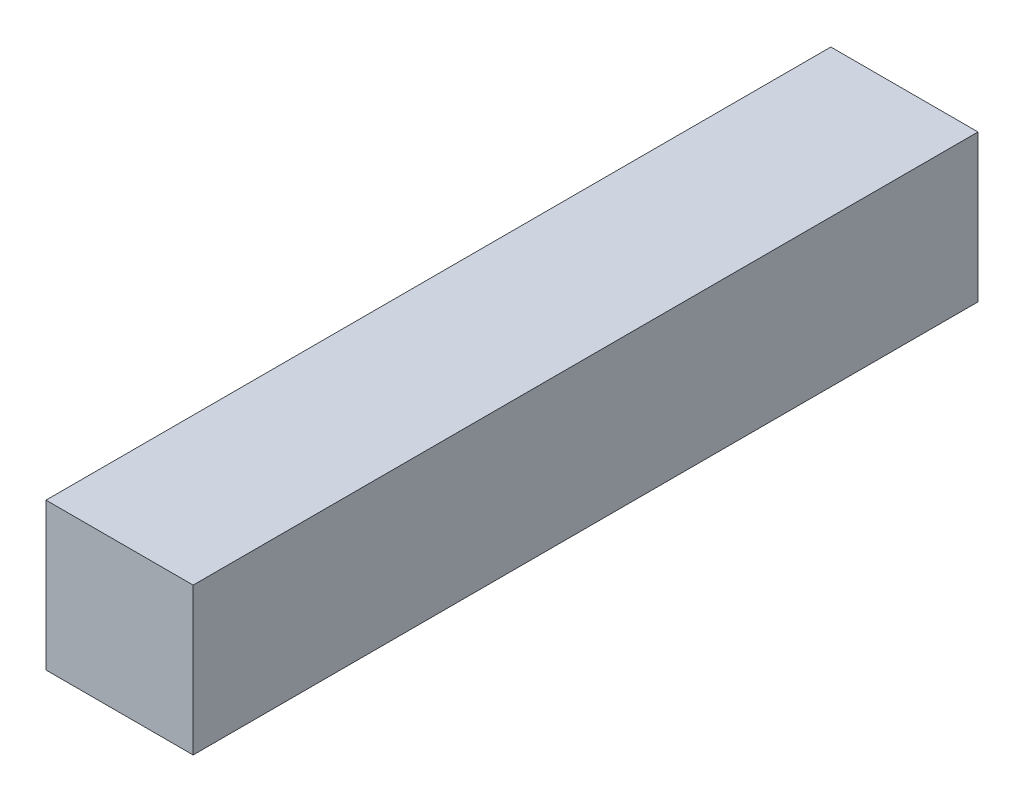
ISO-10303-21;
HEADER;
FILE_DESCRIPTION(('STEP AP214'),'2;1');
FILE_NAME('part.step','',(''),(''),'','','');
FILE_SCHEMA(('AUTOMOTIVE_DESIGN { 1 0 10303 214 1 1 1 1 }'));
ENDSEC;
DATA;
#1=APPLICATION_CONTEXT('core data for automotive mechanical design processes');
#2=APPLICATION_PROTOCOL_DEFINITION('international standard','automotive_design',2000,#1);
#3=PRODUCT_CONTEXT('',#1,'mechanical');
#4=PRODUCT('Part','Part','',(#3));
#5=PRODUCT_RELATED_PRODUCT_CATEGORY('part','',(#4));
#6=PRODUCT_DEFINITION_FORMATION('','',#4);
#7=PRODUCT_DEFINITION_CONTEXT('part definition',#1,'design');
#8=PRODUCT_DEFINITION('design','',#6,#7);
#9=PRODUCT_DEFINITION_SHAPE('','',#8);
#10=(LENGTH_UNIT() NAMED_UNIT(*) SI_UNIT(.MILLI.,.METRE.));
#11=(NAMED_UNIT(*) PLANE_ANGLE_UNIT() SI_UNIT($,.RADIAN.));
#12=(NAMED_UNIT(*) SI_UNIT($,.STERADIAN.) SOLID_ANGLE_UNIT());
#13=UNCERTAINTY_MEASURE_WITH_UNIT(LENGTH_MEASURE(1.E-05),#10,'distance_accuracy_value','');
#14=(GEOMETRIC_REPRESENTATION_CONTEXT(3) GLOBAL_UNCERTAINTY_ASSIGNED_CONTEXT((#13)) GLOBAL_UNIT_ASSIGNED_CONTEXT((#10,
#11,#12)) REPRESENTATION_CONTEXT('',''));
#15=CARTESIAN_POINT('',(0.,0.,0.));
#16=DIRECTION('',(0.,0.,1.));
#17=DIRECTION('',(1.,0.,0.));
#18=AXIS2_PLACEMENT_3D('',#15,#16,#17);
#19=CARTESIAN_POINT('',(2.38125,2.38125,12.7));
#20=DIRECTION('',(-1.,0.,0.));
#21=DIRECTION('',(0.,-1.,0.));
#22=AXIS2_PLACEMENT_3D('',#19,#20,#21);
#23=PLANE('',#22);
#24=DIRECTION('',(0.,1.,0.));
#25=VECTOR('',#24,1.);
#26=CARTESIAN_POINT('',(2.38125,2.38125,-12.7));
#27=LINE('',#26,#25);
#28=CARTESIAN_POINT('',(2.38125,-2.38125,-12.7));
#29=VERTEX_POINT('',#28);
#30=CARTESIAN_POINT('',(2.38125,2.38125,-12.7));
#31=VERTEX_POINT('',#30);
#32=EDGE_CURVE('E106',#29,#31,#27,.T.);
#33=ORIENTED_EDGE('',*,*,#32,.T.);
#34=DIRECTION('',(0.,0.,-1.));
#35=VECTOR('',#34,1.);
#36=CARTESIAN_POINT('',(2.38125,2.38125,12.7));
#37=LINE('',#36,#35);
#38=CARTESIAN_POINT('',(2.38125,2.38125,12.7));
#39=VERTEX_POINT('',#38);
#40=EDGE_CURVE('E11',#39,#31,#37,.T.);
#41=ORIENTED_EDGE('',*,*,#40,.F.);
#42=DIRECTION('',(0.,1.,0.));
#43=VECTOR('',#42,1.);
#44=CARTESIAN_POINT('',(2.38125,2.38125,12.7));
#45=LINE('',#44,#43);
#46=CARTESIAN_POINT('',(2.38125,-2.38125,12.7));
#47=VERTEX_POINT('',#46);
#48=EDGE_CURVE('E94',#47,#39,#45,.T.);
#49=ORIENTED_EDGE('',*,*,#48,.F.);
#50=DIRECTION('',(0.,0.,-1.));
#51=VECTOR('',#50,1.);
#52=CARTESIAN_POINT('',(2.38125,-2.38125,12.7));
#53=LINE('',#52,#51);
#54=EDGE_CURVE('E102',#47,#29,#53,.T.);
#55=ORIENTED_EDGE('',*,*,#54,.T.);
#56=EDGE_LOOP('',(#33,#41,#49,#55));
#57=FACE_BOUND('',#56,.T.);
#58=ADVANCED_FACE('F43',(#57),#23,.F.);
#59=CARTESIAN_POINT('',(-2.38125,2.38125,12.7));
#60=DIRECTION('',(0.,-1.,0.));
#61=DIRECTION('',(0.,0.,-1.));
#62=AXIS2_PLACEMENT_3D('',#59,#60,#61);
#63=PLANE('',#62);
#64=DIRECTION('',(-1.,0.,0.));
#65=VECTOR('',#64,1.);
#66=CARTESIAN_POINT('',(-2.38125,2.38125,-12.7));
#67=LINE('',#66,#65);
#68=CARTESIAN_POINT('',(-2.38125,2.38125,-12.7));
#69=VERTEX_POINT('',#68);
#70=EDGE_CURVE('E98',#31,#69,#67,.T.);
#71=ORIENTED_EDGE('',*,*,#70,.T.);
#72=DIRECTION('',(0.,0.,-1.));
#73=VECTOR('',#72,1.);
#74=CARTESIAN_POINT('',(-2.38125,2.38125,12.7));
#75=LINE('',#74,#73);
#76=CARTESIAN_POINT('',(-2.38125,2.38125,12.7));
#77=VERTEX_POINT('',#76);
#78=EDGE_CURVE('E51',#77,#69,#75,.T.);
#79=ORIENTED_EDGE('',*,*,#78,.F.);
#80=DIRECTION('',(-1.,0.,0.));
#81=VECTOR('',#80,1.);
#82=CARTESIAN_POINT('',(-2.38125,2.38125,12.7));
#83=LINE('',#82,#81);
#84=EDGE_CURVE('E89',#39,#77,#83,.T.);
#85=ORIENTED_EDGE('',*,*,#84,.F.);
#86=ORIENTED_EDGE('',*,*,#40,.T.);
#87=EDGE_LOOP('',(#71,#79,#85,#86));
#88=FACE_BOUND('',#87,.T.);
#89=ADVANCED_FACE('F97',(#88),#63,.F.);
#90=CARTESIAN_POINT('',(-2.38125,2.38125,12.7));
#91=DIRECTION('',(1.,0.,0.));
#92=DIRECTION('',(0.,1.,0.));
#93=AXIS2_PLACEMENT_3D('',#90,#91,#92);
#94=PLANE('',#93);
#95=DIRECTION('',(0.,-1.,0.));
#96=VECTOR('',#95,1.);
#97=CARTESIAN_POINT('',(-2.38125,2.38125,-12.7));
#98=LINE('',#97,#96);
#99=CARTESIAN_POINT('',(-2.38125,-2.38125,-12.7));
#100=VERTEX_POINT('',#99);
#101=EDGE_CURVE('E76',#69,#100,#98,.T.);
#102=ORIENTED_EDGE('',*,*,#101,.T.);
#103=DIRECTION('',(0.,0.,-1.));
#104=VECTOR('',#103,1.);
#105=CARTESIAN_POINT('',(-2.38125,-2.38125,12.7));
#106=LINE('',#105,#104);
#107=CARTESIAN_POINT('',(-2.38125,-2.38125,12.7));
#108=VERTEX_POINT('',#107);
#109=EDGE_CURVE('E99',#108,#100,#106,.T.);
#110=ORIENTED_EDGE('',*,*,#109,.F.);
#111=DIRECTION('',(0.,-1.,0.));
#112=VECTOR('',#111,1.);
#113=CARTESIAN_POINT('',(-2.38125,2.38125,12.7));
#114=LINE('',#113,#112);
#115=EDGE_CURVE('E92',#77,#108,#114,.T.);
#116=ORIENTED_EDGE('',*,*,#115,.F.);
#117=ORIENTED_EDGE('',*,*,#78,.T.);
#118=EDGE_LOOP('',(#102,#110,#116,#117));
#119=FACE_BOUND('',#118,.T.);
#120=ADVANCED_FACE('F100',(#119),#94,.F.);
#121=CARTESIAN_POINT('',(-2.38125,-2.38125,12.7));
#122=DIRECTION('',(0.,1.,0.));
#123=DIRECTION('',(0.,0.,1.));
#124=AXIS2_PLACEMENT_3D('',#121,#122,#123);
#125=PLANE('',#124);
#126=DIRECTION('',(1.,0.,0.));
#127=VECTOR('',#126,1.);
#128=CARTESIAN_POINT('',(-2.38125,-2.38125,-12.7));
#129=LINE('',#128,#127);
#130=EDGE_CURVE('E82',#100,#29,#129,.T.);
#131=ORIENTED_EDGE('',*,*,#130,.T.);
#132=ORIENTED_EDGE('',*,*,#54,.F.);
#133=DIRECTION('',(1.,0.,0.));
#134=VECTOR('',#133,1.);
#135=CARTESIAN_POINT('',(-2.38125,-2.38125,12.7));
#136=LINE('',#135,#134);
#137=EDGE_CURVE('E59',#108,#47,#136,.T.);
#138=ORIENTED_EDGE('',*,*,#137,.F.);
#139=ORIENTED_EDGE('',*,*,#109,.T.);
#140=EDGE_LOOP('',(#131,#132,#138,#139));
#141=FACE_BOUND('',#140,.T.);
#142=ADVANCED_FACE('F113',(#141),#125,.F.);
#143=CARTESIAN_POINT('',(0.,0.,12.7));
#144=DIRECTION('',(0.,0.,1.));
#145=DIRECTION('',(1.,0.,0.));
#146=AXIS2_PLACEMENT_3D('',#143,#144,#145);
#147=PLANE('',#146);
#148=ORIENTED_EDGE('',*,*,#48,.T.);
#149=ORIENTED_EDGE('',*,*,#84,.T.);
#150=ORIENTED_EDGE('',*,*,#115,.T.);
#151=ORIENTED_EDGE('',*,*,#137,.T.);
#152=EDGE_LOOP('',(#148,#149,#150,#151));
#153=FACE_BOUND('',#152,.T.);
#154=ADVANCED_FACE('F90',(#153),#147,.T.);
#155=CARTESIAN_POINT('',(0.,0.,-12.7));
#156=DIRECTION('',(0.,0.,1.));
#157=DIRECTION('',(1.,0.,0.));
#158=AXIS2_PLACEMENT_3D('',#155,#156,#157);
#159=PLANE('',#158);
#160=ORIENTED_EDGE('',*,*,#32,.F.);
#161=ORIENTED_EDGE('',*,*,#130,.F.);
#162=ORIENTED_EDGE('',*,*,#101,.F.);
#163=ORIENTED_EDGE('',*,*,#70,.F.);
#164=EDGE_LOOP('',(#160,#161,#162,#163));
#165=FACE_BOUND('',#164,.T.);
#166=ADVANCED_FACE('F116',(#165),#159,.F.);
#167=CLOSED_SHELL('',(#58,#89,#120,#142,#154,#166));
#168=MANIFOLD_SOLID_BREP('B2',#167);
#169=ADVANCED_BREP_SHAPE_REPRESENTATION('',(#18,#168),#14);
#170=SHAPE_DEFINITION_REPRESENTATION(#9,#169);
ENDSEC;
END-ISO-10303-21;
